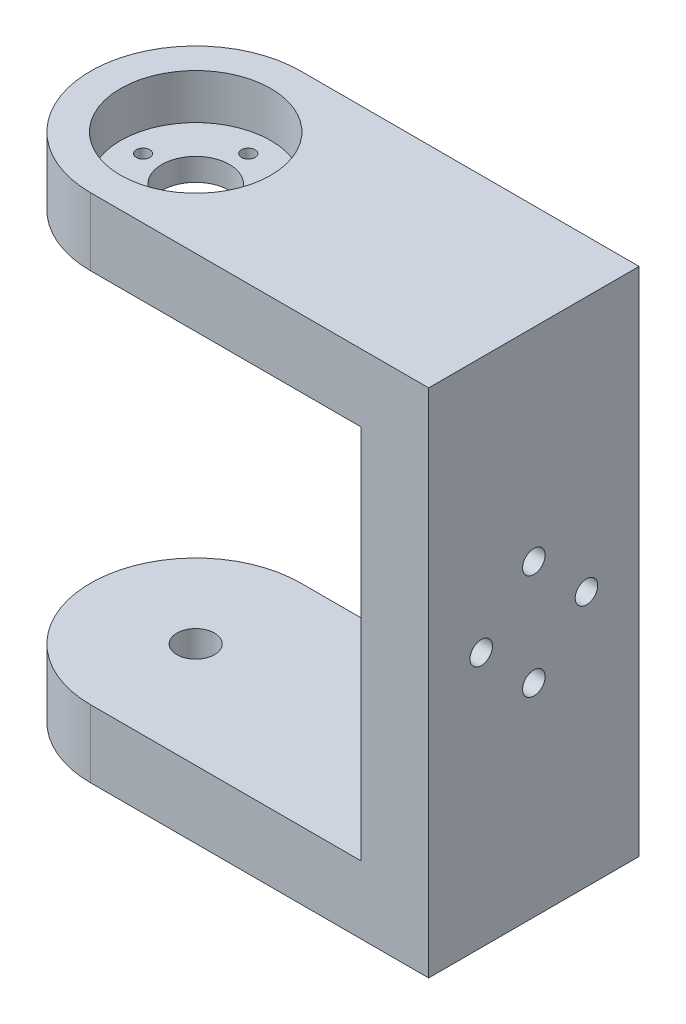
ISO-10303-21;
HEADER;
FILE_DESCRIPTION(('STEP AP214'),'2;1');
FILE_NAME('part.step','',(''),(''),'','','');
FILE_SCHEMA(('AUTOMOTIVE_DESIGN { 1 0 10303 214 1 1 1 1 }'));
ENDSEC;
DATA;
#1=APPLICATION_CONTEXT('core data for automotive mechanical design processes');
#2=APPLICATION_PROTOCOL_DEFINITION('international standard','automotive_design',2000,#1);
#3=PRODUCT_CONTEXT('',#1,'mechanical');
#4=PRODUCT('Part','Part','',(#3));
#5=PRODUCT_RELATED_PRODUCT_CATEGORY('part','',(#4));
#6=PRODUCT_DEFINITION_FORMATION('','',#4);
#7=PRODUCT_DEFINITION_CONTEXT('part definition',#1,'design');
#8=PRODUCT_DEFINITION('design','',#6,#7);
#9=PRODUCT_DEFINITION_SHAPE('','',#8);
#10=(LENGTH_UNIT() NAMED_UNIT(*) SI_UNIT(.MILLI.,.METRE.));
#11=(NAMED_UNIT(*) PLANE_ANGLE_UNIT() SI_UNIT($,.RADIAN.));
#12=(NAMED_UNIT(*) SI_UNIT($,.STERADIAN.) SOLID_ANGLE_UNIT());
#13=UNCERTAINTY_MEASURE_WITH_UNIT(LENGTH_MEASURE(1.E-05),#10,'distance_accuracy_value','');
#14=(GEOMETRIC_REPRESENTATION_CONTEXT(3) GLOBAL_UNCERTAINTY_ASSIGNED_CONTEXT((#13)) GLOBAL_UNIT_ASSIGNED_CONTEXT((#10,
#11,#12)) REPRESENTATION_CONTEXT('',''));
#15=CARTESIAN_POINT('',(0.,0.,0.));
#16=DIRECTION('',(0.,0.,1.));
#17=DIRECTION('',(1.,0.,0.));
#18=AXIS2_PLACEMENT_3D('',#15,#16,#17);
#19=CARTESIAN_POINT('',(-43.8793103448276,25.801724137931,14.));
#20=DIRECTION('',(0.,1.,0.));
#21=DIRECTION('',(-1.,0.,0.));
#22=AXIS2_PLACEMENT_3D('',#19,#20,#21);
#23=CYLINDRICAL_SURFACE('',#22,4.5);
#24=CARTESIAN_POINT('',(-43.8793103448276,26.801724137931,14.));
#25=DIRECTION('',(0.,-1.,0.));
#26=DIRECTION('',(1.,0.,0.));
#27=AXIS2_PLACEMENT_3D('',#24,#25,#26);
#28=CIRCLE('',#27,4.5);
#29=CARTESIAN_POINT('',(-39.3793103448276,26.801724137931,14.));
#30=VERTEX_POINT('',#29);
#31=EDGE_CURVE('E141',#30,#30,#28,.T.);
#32=ORIENTED_EDGE('',*,*,#31,.T.);
#33=EDGE_LOOP('',(#32));
#34=FACE_BOUND('',#33,.T.);
#35=CARTESIAN_POINT('',(-43.8793103448276,29.801724137931,14.));
#36=DIRECTION('',(0.,1.,0.));
#37=DIRECTION('',(-1.,0.,0.));
#38=AXIS2_PLACEMENT_3D('',#35,#36,#37);
#39=CIRCLE('',#38,4.5);
#40=CARTESIAN_POINT('',(-48.3793103448276,29.801724137931,14.));
#41=VERTEX_POINT('',#40);
#42=EDGE_CURVE('E69',#41,#41,#39,.F.);
#43=ORIENTED_EDGE('',*,*,#42,.F.);
#44=EDGE_LOOP('',(#43));
#45=FACE_BOUND('',#44,.T.);
#46=ADVANCED_FACE('F65',(#34,#45),#23,.F.);
#47=CARTESIAN_POINT('',(0.,35.801724137931,28.));
#48=DIRECTION('',(0.,-1.,0.));
#49=DIRECTION('',(1.,0.,0.));
#50=AXIS2_PLACEMENT_3D('',#47,#48,#49);
#51=PLANE('',#50);
#52=CARTESIAN_POINT('',(-43.8793103448276,35.801724137931,14.));
#53=DIRECTION('',(0.,1.,0.));
#54=DIRECTION('',(-1.,0.,0.));
#55=AXIS2_PLACEMENT_3D('',#52,#53,#54);
#56=CIRCLE('',#55,10.);
#57=CARTESIAN_POINT('',(-53.8793103448276,35.801724137931,14.));
#58=VERTEX_POINT('',#57);
#59=EDGE_CURVE('E211',#58,#58,#56,.T.);
#60=ORIENTED_EDGE('',*,*,#59,.F.);
#61=EDGE_LOOP('',(#60));
#62=FACE_BOUND('',#61,.T.);
#63=DIRECTION('',(-1.,0.,0.));
#64=VECTOR('',#63,1.);
#65=CARTESIAN_POINT('',(0.,35.801724137931,0.));
#66=LINE('',#65,#64);
#67=CARTESIAN_POINT('',(1.1206896551724,35.801724137931,0.));
#68=VERTEX_POINT('',#67);
#69=CARTESIAN_POINT('',(-43.8793103448276,35.801724137931,0.));
#70=VERTEX_POINT('',#69);
#71=EDGE_CURVE('E148',#68,#70,#66,.T.);
#72=ORIENTED_EDGE('',*,*,#71,.T.);
#73=CARTESIAN_POINT('',(-43.8793103448276,35.801724137931,14.));
#74=DIRECTION('',(0.,1.,0.));
#75=DIRECTION('',(-1.,0.,0.));
#76=AXIS2_PLACEMENT_3D('',#73,#74,#75);
#77=CIRCLE('',#76,14.);
#78=CARTESIAN_POINT('',(-43.8793103448276,35.801724137931,28.));
#79=VERTEX_POINT('',#78);
#80=EDGE_CURVE('E131',#70,#79,#77,.T.);
#81=ORIENTED_EDGE('',*,*,#80,.T.);
#82=DIRECTION('',(-1.,0.,0.));
#83=VECTOR('',#82,1.);
#84=CARTESIAN_POINT('',(0.,35.801724137931,28.));
#85=LINE('',#84,#83);
#86=CARTESIAN_POINT('',(1.1206896551724,35.801724137931,28.));
#87=VERTEX_POINT('',#86);
#88=EDGE_CURVE('E182',#87,#79,#85,.T.);
#89=ORIENTED_EDGE('',*,*,#88,.F.);
#90=DIRECTION('',(0.,0.,-1.));
#91=VECTOR('',#90,1.);
#92=CARTESIAN_POINT('',(1.1206896551724,35.801724137931,28.));
#93=LINE('',#92,#91);
#94=EDGE_CURVE('E155',#87,#68,#93,.T.);
#95=ORIENTED_EDGE('',*,*,#94,.T.);
#96=EDGE_LOOP('',(#72,#81,#89,#95));
#97=FACE_BOUND('',#96,.T.);
#98=ADVANCED_FACE('F67',(#62,#97),#51,.F.);
#99=CARTESIAN_POINT('',(0.,26.801724137931,28.));
#100=DIRECTION('',(0.,-1.,0.));
#101=DIRECTION('',(1.,0.,0.));
#102=AXIS2_PLACEMENT_3D('',#99,#100,#101);
#103=PLANE('',#102);
#104=CARTESIAN_POINT('',(-43.8793103448276,26.801724137931,21.0030113948443));
#105=DIRECTION('',(0.,-1.,0.));
#106=DIRECTION('',(1.,0.,0.));
#107=AXIS2_PLACEMENT_3D('',#104,#105,#106);
#108=CIRCLE('',#107,0.899999999999996);
#109=CARTESIAN_POINT('',(-42.9793103448276,26.801724137931,21.0030113948443));
#110=VERTEX_POINT('',#109);
#111=EDGE_CURVE('E323',#110,#110,#108,.T.);
#112=ORIENTED_EDGE('',*,*,#111,.F.);
#113=EDGE_LOOP('',(#112));
#114=FACE_BOUND('',#113,.T.);
#115=CARTESIAN_POINT('',(-36.8793103448276,26.801724137931,14.));
#116=DIRECTION('',(0.,-1.,0.));
#117=DIRECTION('',(1.,0.,0.));
#118=AXIS2_PLACEMENT_3D('',#115,#116,#117);
#119=CIRCLE('',#118,0.899999999999997);
#120=CARTESIAN_POINT('',(-35.9793103448276,26.801724137931,14.));
#121=VERTEX_POINT('',#120);
#122=EDGE_CURVE('E329',#121,#121,#119,.T.);
#123=ORIENTED_EDGE('',*,*,#122,.F.);
#124=EDGE_LOOP('',(#123));
#125=FACE_BOUND('',#124,.T.);
#126=CARTESIAN_POINT('',(-43.8793103448276,26.801724137931,7.));
#127=DIRECTION('',(0.,-1.,0.));
#128=DIRECTION('',(1.,0.,0.));
#129=AXIS2_PLACEMENT_3D('',#126,#127,#128);
#130=CIRCLE('',#129,0.899999999999997);
#131=CARTESIAN_POINT('',(-42.9793103448276,26.801724137931,7.));
#132=VERTEX_POINT('',#131);
#133=EDGE_CURVE('E406',#132,#132,#130,.T.);
#134=ORIENTED_EDGE('',*,*,#133,.F.);
#135=EDGE_LOOP('',(#134));
#136=FACE_BOUND('',#135,.T.);
#137=CARTESIAN_POINT('',(-50.8793103448276,26.801724137931,14.));
#138=DIRECTION('',(0.,-1.,0.));
#139=DIRECTION('',(1.,0.,0.));
#140=AXIS2_PLACEMENT_3D('',#137,#138,#139);
#141=CIRCLE('',#140,0.899999999999997);
#142=CARTESIAN_POINT('',(-49.9793103448276,26.801724137931,14.));
#143=VERTEX_POINT('',#142);
#144=EDGE_CURVE('E402',#143,#143,#141,.T.);
#145=ORIENTED_EDGE('',*,*,#144,.F.);
#146=EDGE_LOOP('',(#145));
#147=FACE_BOUND('',#146,.T.);
#148=ORIENTED_EDGE('',*,*,#31,.F.);
#149=EDGE_LOOP('',(#148));
#150=FACE_BOUND('',#149,.T.);
#151=CARTESIAN_POINT('',(-43.8793103448276,26.801724137931,14.));
#152=DIRECTION('',(0.,-1.,0.));
#153=DIRECTION('',(1.,0.,0.));
#154=AXIS2_PLACEMENT_3D('',#151,#152,#153);
#155=CIRCLE('',#154,14.);
#156=CARTESIAN_POINT('',(-43.8793103448276,26.801724137931,28.));
#157=VERTEX_POINT('',#156);
#158=CARTESIAN_POINT('',(-43.8793103448276,26.801724137931,0.));
#159=VERTEX_POINT('',#158);
#160=EDGE_CURVE('E91',#157,#159,#155,.T.);
#161=ORIENTED_EDGE('',*,*,#160,.T.);
#162=DIRECTION('',(-1.,0.,0.));
#163=VECTOR('',#162,1.);
#164=CARTESIAN_POINT('',(0.,26.801724137931,0.));
#165=LINE('',#164,#163);
#166=CARTESIAN_POINT('',(-7.8793103448276,26.801724137931,0.));
#167=VERTEX_POINT('',#166);
#168=EDGE_CURVE('E152',#167,#159,#165,.T.);
#169=ORIENTED_EDGE('',*,*,#168,.F.);
#170=DIRECTION('',(0.,0.,-1.));
#171=VECTOR('',#170,1.);
#172=CARTESIAN_POINT('',(-7.8793103448276,26.801724137931,28.));
#173=LINE('',#172,#171);
#174=CARTESIAN_POINT('',(-7.8793103448276,26.801724137931,28.));
#175=VERTEX_POINT('',#174);
#176=EDGE_CURVE('E193',#175,#167,#173,.T.);
#177=ORIENTED_EDGE('',*,*,#176,.F.);
#178=DIRECTION('',(-1.,0.,0.));
#179=VECTOR('',#178,1.);
#180=CARTESIAN_POINT('',(0.,26.801724137931,28.));
#181=LINE('',#180,#179);
#182=EDGE_CURVE('E231',#175,#157,#181,.T.);
#183=ORIENTED_EDGE('',*,*,#182,.T.);
#184=EDGE_LOOP('',(#161,#169,#177,#183));
#185=FACE_BOUND('',#184,.T.);
#186=ADVANCED_FACE('F254',(#114,#125,#136,#147,#150,#185),#103,.T.);
#187=CARTESIAN_POINT('',(0.,-23.198275862069,28.));
#188=DIRECTION('',(0.,-1.,0.));
#189=DIRECTION('',(1.,0.,0.));
#190=AXIS2_PLACEMENT_3D('',#187,#188,#189);
#191=PLANE('',#190);
#192=CARTESIAN_POINT('',(-43.8793103448276,-23.198275862069,14.));
#193=DIRECTION('',(0.,-1.,0.));
#194=DIRECTION('',(1.,0.,0.));
#195=AXIS2_PLACEMENT_3D('',#192,#193,#194);
#196=CIRCLE('',#195,2.5);
#197=CARTESIAN_POINT('',(-41.3793103448276,-23.198275862069,14.));
#198=VERTEX_POINT('',#197);
#199=EDGE_CURVE('E157',#198,#198,#196,.T.);
#200=ORIENTED_EDGE('',*,*,#199,.T.);
#201=EDGE_LOOP('',(#200));
#202=FACE_BOUND('',#201,.T.);
#203=DIRECTION('',(-1.,0.,0.));
#204=VECTOR('',#203,1.);
#205=CARTESIAN_POINT('',(0.,-23.198275862069,0.));
#206=LINE('',#205,#204);
#207=CARTESIAN_POINT('',(-7.8793103448276,-23.198275862069,0.));
#208=VERTEX_POINT('',#207);
#209=CARTESIAN_POINT('',(-43.8793103448276,-23.198275862069,0.));
#210=VERTEX_POINT('',#209);
#211=EDGE_CURVE('E172',#208,#210,#206,.T.);
#212=ORIENTED_EDGE('',*,*,#211,.T.);
#213=CARTESIAN_POINT('',(-43.8793103448276,-23.198275862069,14.));
#214=DIRECTION('',(0.,-1.,0.));
#215=DIRECTION('',(1.,0.,0.));
#216=AXIS2_PLACEMENT_3D('',#213,#214,#215);
#217=CIRCLE('',#216,14.);
#218=CARTESIAN_POINT('',(-43.8793103448276,-23.198275862069,28.));
#219=VERTEX_POINT('',#218);
#220=EDGE_CURVE('E224',#219,#210,#217,.T.);
#221=ORIENTED_EDGE('',*,*,#220,.F.);
#222=DIRECTION('',(-1.,0.,0.));
#223=VECTOR('',#222,1.);
#224=CARTESIAN_POINT('',(0.,-23.198275862069,28.));
#225=LINE('',#224,#223);
#226=CARTESIAN_POINT('',(-7.8793103448276,-23.198275862069,28.));
#227=VERTEX_POINT('',#226);
#228=EDGE_CURVE('E238',#227,#219,#225,.T.);
#229=ORIENTED_EDGE('',*,*,#228,.F.);
#230=DIRECTION('',(0.,0.,-1.));
#231=VECTOR('',#230,1.);
#232=CARTESIAN_POINT('',(-7.8793103448276,-23.198275862069,28.));
#233=LINE('',#232,#231);
#234=EDGE_CURVE('E189',#227,#208,#233,.T.);
#235=ORIENTED_EDGE('',*,*,#234,.T.);
#236=EDGE_LOOP('',(#212,#221,#229,#235));
#237=FACE_BOUND('',#236,.T.);
#238=ADVANCED_FACE('F262',(#202,#237),#191,.F.);
#239=CARTESIAN_POINT('',(0.,-32.198275862069,28.));
#240=DIRECTION('',(0.,1.,0.));
#241=DIRECTION('',(-1.,0.,0.));
#242=AXIS2_PLACEMENT_3D('',#239,#240,#241);
#243=PLANE('',#242);
#244=CARTESIAN_POINT('',(-43.8793103448276,-32.198275862069,14.));
#245=DIRECTION('',(0.,1.,0.));
#246=DIRECTION('',(-1.,0.,0.));
#247=AXIS2_PLACEMENT_3D('',#244,#245,#246);
#248=CIRCLE('',#247,2.5);
#249=CARTESIAN_POINT('',(-46.3793103448276,-32.198275862069,14.));
#250=VERTEX_POINT('',#249);
#251=EDGE_CURVE('E164',#250,#250,#248,.T.);
#252=ORIENTED_EDGE('',*,*,#251,.T.);
#253=EDGE_LOOP('',(#252));
#254=FACE_BOUND('',#253,.T.);
#255=CARTESIAN_POINT('',(-43.8793103448276,-32.198275862069,14.));
#256=DIRECTION('',(0.,1.,0.));
#257=DIRECTION('',(-1.,0.,0.));
#258=AXIS2_PLACEMENT_3D('',#255,#256,#257);
#259=CIRCLE('',#258,14.);
#260=CARTESIAN_POINT('',(-43.8793103448276,-32.198275862069,0.));
#261=VERTEX_POINT('',#260);
#262=CARTESIAN_POINT('',(-43.8793103448276,-32.198275862069,28.));
#263=VERTEX_POINT('',#262);
#264=EDGE_CURVE('E83',#261,#263,#259,.T.);
#265=ORIENTED_EDGE('',*,*,#264,.F.);
#266=DIRECTION('',(1.,0.,0.));
#267=VECTOR('',#266,1.);
#268=CARTESIAN_POINT('',(0.,-32.198275862069,0.));
#269=LINE('',#268,#267);
#270=CARTESIAN_POINT('',(1.1206896551724,-32.198275862069,0.));
#271=VERTEX_POINT('',#270);
#272=EDGE_CURVE('E176',#261,#271,#269,.T.);
#273=ORIENTED_EDGE('',*,*,#272,.T.);
#274=DIRECTION('',(0.,0.,-1.));
#275=VECTOR('',#274,1.);
#276=CARTESIAN_POINT('',(1.1206896551724,-32.198275862069,28.));
#277=LINE('',#276,#275);
#278=CARTESIAN_POINT('',(1.1206896551724,-32.198275862069,28.));
#279=VERTEX_POINT('',#278);
#280=EDGE_CURVE('E185',#279,#271,#277,.T.);
#281=ORIENTED_EDGE('',*,*,#280,.F.);
#282=DIRECTION('',(1.,0.,0.));
#283=VECTOR('',#282,1.);
#284=CARTESIAN_POINT('',(0.,-32.198275862069,28.));
#285=LINE('',#284,#283);
#286=EDGE_CURVE('E241',#263,#279,#285,.T.);
#287=ORIENTED_EDGE('',*,*,#286,.F.);
#288=EDGE_LOOP('',(#265,#273,#281,#287));
#289=FACE_BOUND('',#288,.T.);
#290=ADVANCED_FACE('F266',(#254,#289),#243,.F.);
#291=CARTESIAN_POINT('',(-7.8793103448276,0.,28.));
#292=DIRECTION('',(1.,0.,0.));
#293=DIRECTION('',(0.,0.,-1.));
#294=AXIS2_PLACEMENT_3D('',#291,#292,#293);
#295=PLANE('',#294);
#296=CARTESIAN_POINT('',(-7.8793103448276,8.80172413793104,14.));
#297=DIRECTION('',(1.,0.,0.));
#298=DIRECTION('',(0.,0.,-1.));
#299=AXIS2_PLACEMENT_3D('',#296,#297,#298);
#300=CIRCLE('',#299,1.5);
#301=CARTESIAN_POINT('',(-7.8793103448276,8.80172413793104,12.5));
#302=VERTEX_POINT('',#301);
#303=EDGE_CURVE('E217',#302,#302,#300,.T.);
#304=ORIENTED_EDGE('',*,*,#303,.T.);
#305=EDGE_LOOP('',(#304));
#306=FACE_BOUND('',#305,.T.);
#307=CARTESIAN_POINT('',(-7.8793103448276,-5.19827586206896,14.));
#308=DIRECTION('',(1.,0.,0.));
#309=DIRECTION('',(0.,0.,-1.));
#310=AXIS2_PLACEMENT_3D('',#307,#308,#309);
#311=CIRCLE('',#310,1.5);
#312=CARTESIAN_POINT('',(-7.8793103448276,-5.19827586206896,12.5));
#313=VERTEX_POINT('',#312);
#314=EDGE_CURVE('E340',#313,#313,#311,.T.);
#315=ORIENTED_EDGE('',*,*,#314,.T.);
#316=EDGE_LOOP('',(#315));
#317=FACE_BOUND('',#316,.T.);
#318=CARTESIAN_POINT('',(-7.8793103448276,1.80172413793104,7.00000000000001));
#319=DIRECTION('',(1.,0.,0.));
#320=DIRECTION('',(0.,0.,-1.));
#321=AXIS2_PLACEMENT_3D('',#318,#319,#320);
#322=CIRCLE('',#321,1.5);
#323=CARTESIAN_POINT('',(-7.8793103448276,1.80172413793104,5.50000000000001));
#324=VERTEX_POINT('',#323);
#325=EDGE_CURVE('E337',#324,#324,#322,.T.);
#326=ORIENTED_EDGE('',*,*,#325,.T.);
#327=EDGE_LOOP('',(#326));
#328=FACE_BOUND('',#327,.T.);
#329=CARTESIAN_POINT('',(-7.8793103448276,1.80172413793104,21.));
#330=DIRECTION('',(1.,0.,0.));
#331=DIRECTION('',(0.,0.,-1.));
#332=AXIS2_PLACEMENT_3D('',#329,#330,#331);
#333=CIRCLE('',#332,1.5);
#334=CARTESIAN_POINT('',(-7.8793103448276,1.80172413793104,19.5));
#335=VERTEX_POINT('',#334);
#336=EDGE_CURVE('E333',#335,#335,#333,.T.);
#337=ORIENTED_EDGE('',*,*,#336,.T.);
#338=EDGE_LOOP('',(#337));
#339=FACE_BOUND('',#338,.T.);
#340=DIRECTION('',(0.,-1.,0.));
#341=VECTOR('',#340,1.);
#342=CARTESIAN_POINT('',(-7.8793103448276,0.,0.));
#343=LINE('',#342,#341);
#344=EDGE_CURVE('E161',#167,#208,#343,.T.);
#345=ORIENTED_EDGE('',*,*,#344,.T.);
#346=ORIENTED_EDGE('',*,*,#234,.F.);
#347=DIRECTION('',(0.,-1.,0.));
#348=VECTOR('',#347,1.);
#349=CARTESIAN_POINT('',(-7.8793103448276,0.,28.));
#350=LINE('',#349,#348);
#351=EDGE_CURVE('E235',#175,#227,#350,.T.);
#352=ORIENTED_EDGE('',*,*,#351,.F.);
#353=ORIENTED_EDGE('',*,*,#176,.T.);
#354=EDGE_LOOP('',(#345,#346,#352,#353));
#355=FACE_BOUND('',#354,.T.);
#356=ADVANCED_FACE('F258',(#306,#317,#328,#339,#355),#295,.F.);
#357=CARTESIAN_POINT('',(1.1206896551724,0.,28.));
#358=DIRECTION('',(1.,0.,0.));
#359=DIRECTION('',(0.,1.,0.));
#360=AXIS2_PLACEMENT_3D('',#357,#358,#359);
#361=PLANE('',#360);
#362=CARTESIAN_POINT('',(1.1206896551724,8.80172413793104,14.));
#363=DIRECTION('',(1.,0.,0.));
#364=DIRECTION('',(0.,1.,0.));
#365=AXIS2_PLACEMENT_3D('',#362,#363,#364);
#366=CIRCLE('',#365,1.5);
#367=CARTESIAN_POINT('',(1.1206896551724,10.301724137931,14.));
#368=VERTEX_POINT('',#367);
#369=EDGE_CURVE('E309',#368,#368,#366,.T.);
#370=ORIENTED_EDGE('',*,*,#369,.F.);
#371=EDGE_LOOP('',(#370));
#372=FACE_BOUND('',#371,.T.);
#373=CARTESIAN_POINT('',(1.1206896551724,-5.19827586206896,14.));
#374=DIRECTION('',(1.,0.,0.));
#375=DIRECTION('',(0.,1.,0.));
#376=AXIS2_PLACEMENT_3D('',#373,#374,#375);
#377=CIRCLE('',#376,1.5);
#378=CARTESIAN_POINT('',(1.1206896551724,-3.69827586206896,14.));
#379=VERTEX_POINT('',#378);
#380=EDGE_CURVE('E313',#379,#379,#377,.T.);
#381=ORIENTED_EDGE('',*,*,#380,.F.);
#382=EDGE_LOOP('',(#381));
#383=FACE_BOUND('',#382,.T.);
#384=CARTESIAN_POINT('',(1.1206896551724,1.80172413793104,7.00000000000001));
#385=DIRECTION('',(1.,0.,0.));
#386=DIRECTION('',(0.,1.,0.));
#387=AXIS2_PLACEMENT_3D('',#384,#385,#386);
#388=CIRCLE('',#387,1.5);
#389=CARTESIAN_POINT('',(1.1206896551724,3.30172413793104,7.00000000000001));
#390=VERTEX_POINT('',#389);
#391=EDGE_CURVE('E317',#390,#390,#388,.T.);
#392=ORIENTED_EDGE('',*,*,#391,.F.);
#393=EDGE_LOOP('',(#392));
#394=FACE_BOUND('',#393,.T.);
#395=CARTESIAN_POINT('',(1.1206896551724,1.80172413793104,21.));
#396=DIRECTION('',(1.,0.,0.));
#397=DIRECTION('',(0.,1.,0.));
#398=AXIS2_PLACEMENT_3D('',#395,#396,#397);
#399=CIRCLE('',#398,1.5);
#400=CARTESIAN_POINT('',(1.1206896551724,3.30172413793104,21.));
#401=VERTEX_POINT('',#400);
#402=EDGE_CURVE('E320',#401,#401,#399,.T.);
#403=ORIENTED_EDGE('',*,*,#402,.F.);
#404=EDGE_LOOP('',(#403));
#405=FACE_BOUND('',#404,.T.);
#406=DIRECTION('',(0.,-1.,0.));
#407=VECTOR('',#406,1.);
#408=CARTESIAN_POINT('',(1.1206896551724,0.,0.));
#409=LINE('',#408,#407);
#410=EDGE_CURVE('E179',#68,#271,#409,.T.);
#411=ORIENTED_EDGE('',*,*,#410,.F.);
#412=ORIENTED_EDGE('',*,*,#94,.F.);
#413=DIRECTION('',(0.,-1.,0.));
#414=VECTOR('',#413,1.);
#415=CARTESIAN_POINT('',(1.1206896551724,0.,28.));
#416=LINE('',#415,#414);
#417=EDGE_CURVE('E167',#87,#279,#416,.T.);
#418=ORIENTED_EDGE('',*,*,#417,.T.);
#419=ORIENTED_EDGE('',*,*,#280,.T.);
#420=EDGE_LOOP('',(#411,#412,#418,#419));
#421=FACE_BOUND('',#420,.T.);
#422=ADVANCED_FACE('F250',(#372,#383,#394,#405,#421),#361,.T.);
#423=CARTESIAN_POINT('',(0.,0.,28.));
#424=DIRECTION('',(0.,0.,1.));
#425=DIRECTION('',(1.,0.,0.));
#426=AXIS2_PLACEMENT_3D('',#423,#424,#425);
#427=PLANE('',#426);
#428=DIRECTION('',(0.,1.,0.));
#429=VECTOR('',#428,1.);
#430=CARTESIAN_POINT('',(-43.8793103448276,-64.198275862069,28.));
#431=LINE('',#430,#429);
#432=EDGE_CURVE('E154',#263,#219,#431,.T.);
#433=ORIENTED_EDGE('',*,*,#432,.F.);
#434=ORIENTED_EDGE('',*,*,#286,.T.);
#435=ORIENTED_EDGE('',*,*,#417,.F.);
#436=ORIENTED_EDGE('',*,*,#88,.T.);
#437=EDGE_CURVE('E135',#157,#79,#431,.T.);
#438=ORIENTED_EDGE('',*,*,#437,.F.);
#439=ORIENTED_EDGE('',*,*,#182,.F.);
#440=ORIENTED_EDGE('',*,*,#351,.T.);
#441=ORIENTED_EDGE('',*,*,#228,.T.);
#442=EDGE_LOOP('',(#433,#434,#435,#436,#438,#439,#440,#441));
#443=FACE_BOUND('',#442,.T.);
#444=ADVANCED_FACE('F251',(#443),#427,.T.);
#445=CARTESIAN_POINT('',(0.,0.,0.));
#446=DIRECTION('',(0.,0.,1.));
#447=DIRECTION('',(1.,0.,0.));
#448=AXIS2_PLACEMENT_3D('',#445,#446,#447);
#449=PLANE('',#448);
#450=ORIENTED_EDGE('',*,*,#272,.F.);
#451=DIRECTION('',(0.,1.,0.));
#452=VECTOR('',#451,1.);
#453=CARTESIAN_POINT('',(-43.8793103448276,-64.198275862069,0.));
#454=LINE('',#453,#452);
#455=EDGE_CURVE('E12',#261,#210,#454,.T.);
#456=ORIENTED_EDGE('',*,*,#455,.T.);
#457=ORIENTED_EDGE('',*,*,#211,.F.);
#458=ORIENTED_EDGE('',*,*,#344,.F.);
#459=ORIENTED_EDGE('',*,*,#168,.T.);
#460=EDGE_CURVE('E75',#159,#70,#454,.T.);
#461=ORIENTED_EDGE('',*,*,#460,.T.);
#462=ORIENTED_EDGE('',*,*,#71,.F.);
#463=ORIENTED_EDGE('',*,*,#410,.T.);
#464=EDGE_LOOP('',(#450,#456,#457,#458,#459,#461,#462,#463));
#465=FACE_BOUND('',#464,.T.);
#466=ADVANCED_FACE('F146',(#465),#449,.F.);
#467=CARTESIAN_POINT('',(-43.8793103448276,-64.198275862069,14.));
#468=DIRECTION('',(0.,1.,0.));
#469=DIRECTION('',(-1.,0.,0.));
#470=AXIS2_PLACEMENT_3D('',#467,#468,#469);
#471=CYLINDRICAL_SURFACE('',#470,14.);
#472=ORIENTED_EDGE('',*,*,#437,.T.);
#473=ORIENTED_EDGE('',*,*,#80,.F.);
#474=ORIENTED_EDGE('',*,*,#460,.F.);
#475=ORIENTED_EDGE('',*,*,#160,.F.);
#476=EDGE_LOOP('',(#472,#473,#474,#475));
#477=FACE_BOUND('',#476,.T.);
#478=ADVANCED_FACE('F133',(#477),#471,.T.);
#479=ORIENTED_EDGE('',*,*,#220,.T.);
#480=ORIENTED_EDGE('',*,*,#455,.F.);
#481=ORIENTED_EDGE('',*,*,#264,.T.);
#482=ORIENTED_EDGE('',*,*,#432,.T.);
#483=EDGE_LOOP('',(#479,#480,#481,#482));
#484=FACE_BOUND('',#483,.T.);
#485=ADVANCED_FACE('F264',(#484),#471,.T.);
#486=CARTESIAN_POINT('',(-43.8793103448276,-64.198275862069,14.));
#487=DIRECTION('',(0.,1.,0.));
#488=DIRECTION('',(-1.,0.,0.));
#489=AXIS2_PLACEMENT_3D('',#486,#487,#488);
#490=CYLINDRICAL_SURFACE('',#489,2.5);
#491=ORIENTED_EDGE('',*,*,#251,.F.);
#492=EDGE_LOOP('',(#491));
#493=FACE_BOUND('',#492,.T.);
#494=ORIENTED_EDGE('',*,*,#199,.F.);
#495=EDGE_LOOP('',(#494));
#496=FACE_BOUND('',#495,.T.);
#497=ADVANCED_FACE('F293',(#493,#496),#490,.F.);
#498=CARTESIAN_POINT('',(-43.8793103448276,29.801724137931,14.));
#499=DIRECTION('',(0.,1.,0.));
#500=DIRECTION('',(-1.,0.,0.));
#501=AXIS2_PLACEMENT_3D('',#498,#499,#500);
#502=PLANE('',#501);
#503=CARTESIAN_POINT('',(-43.8793103448276,29.801724137931,21.0030113948443));
#504=DIRECTION('',(0.,1.,0.));
#505=DIRECTION('',(-1.,0.,0.));
#506=AXIS2_PLACEMENT_3D('',#503,#504,#505);
#507=CIRCLE('',#506,0.899999999999996);
#508=CARTESIAN_POINT('',(-44.7793103448276,29.801724137931,21.0030113948443));
#509=VERTEX_POINT('',#508);
#510=EDGE_CURVE('E383',#509,#509,#507,.T.);
#511=ORIENTED_EDGE('',*,*,#510,.F.);
#512=EDGE_LOOP('',(#511));
#513=FACE_BOUND('',#512,.T.);
#514=CARTESIAN_POINT('',(-36.8793103448276,29.801724137931,14.));
#515=DIRECTION('',(0.,1.,0.));
#516=DIRECTION('',(-1.,0.,0.));
#517=AXIS2_PLACEMENT_3D('',#514,#515,#516);
#518=CIRCLE('',#517,0.899999999999997);
#519=CARTESIAN_POINT('',(-37.7793103448276,29.801724137931,14.));
#520=VERTEX_POINT('',#519);
#521=EDGE_CURVE('E387',#520,#520,#518,.T.);
#522=ORIENTED_EDGE('',*,*,#521,.F.);
#523=EDGE_LOOP('',(#522));
#524=FACE_BOUND('',#523,.T.);
#525=CARTESIAN_POINT('',(-43.8793103448276,29.801724137931,7.));
#526=DIRECTION('',(0.,1.,0.));
#527=DIRECTION('',(-1.,0.,0.));
#528=AXIS2_PLACEMENT_3D('',#525,#526,#527);
#529=CIRCLE('',#528,0.899999999999997);
#530=CARTESIAN_POINT('',(-44.7793103448276,29.801724137931,7.));
#531=VERTEX_POINT('',#530);
#532=EDGE_CURVE('E391',#531,#531,#529,.T.);
#533=ORIENTED_EDGE('',*,*,#532,.F.);
#534=EDGE_LOOP('',(#533));
#535=FACE_BOUND('',#534,.T.);
#536=CARTESIAN_POINT('',(-50.8793103448276,29.801724137931,14.));
#537=DIRECTION('',(0.,1.,0.));
#538=DIRECTION('',(-1.,0.,0.));
#539=AXIS2_PLACEMENT_3D('',#536,#537,#538);
#540=CIRCLE('',#539,0.899999999999997);
#541=CARTESIAN_POINT('',(-51.7793103448276,29.801724137931,14.));
#542=VERTEX_POINT('',#541);
#543=EDGE_CURVE('E394',#542,#542,#540,.T.);
#544=ORIENTED_EDGE('',*,*,#543,.F.);
#545=EDGE_LOOP('',(#544));
#546=FACE_BOUND('',#545,.T.);
#547=CARTESIAN_POINT('',(-43.8793103448276,29.801724137931,14.));
#548=DIRECTION('',(0.,1.,0.));
#549=DIRECTION('',(-1.,0.,0.));
#550=AXIS2_PLACEMENT_3D('',#547,#548,#549);
#551=CIRCLE('',#550,10.);
#552=CARTESIAN_POINT('',(-53.8793103448276,29.801724137931,14.));
#553=VERTEX_POINT('',#552);
#554=EDGE_CURVE('E206',#553,#553,#551,.T.);
#555=ORIENTED_EDGE('',*,*,#554,.T.);
#556=EDGE_LOOP('',(#555));
#557=FACE_BOUND('',#556,.T.);
#558=ORIENTED_EDGE('',*,*,#42,.T.);
#559=EDGE_LOOP('',(#558));
#560=FACE_BOUND('',#559,.T.);
#561=ADVANCED_FACE('F296',(#513,#524,#535,#546,#557,#560),#502,.T.);
#562=CARTESIAN_POINT('',(-43.8793103448276,29.801724137931,14.));
#563=DIRECTION('',(0.,1.,0.));
#564=DIRECTION('',(-1.,0.,0.));
#565=AXIS2_PLACEMENT_3D('',#562,#563,#564);
#566=CYLINDRICAL_SURFACE('',#565,10.);
#567=ORIENTED_EDGE('',*,*,#554,.F.);
#568=EDGE_LOOP('',(#567));
#569=FACE_BOUND('',#568,.T.);
#570=ORIENTED_EDGE('',*,*,#59,.T.);
#571=EDGE_LOOP('',(#570));
#572=FACE_BOUND('',#571,.T.);
#573=ADVANCED_FACE('F289',(#569,#572),#566,.F.);
#574=CARTESIAN_POINT('',(-8.8793103448276,1.80172413793104,21.));
#575=DIRECTION('',(1.,0.,0.));
#576=DIRECTION('',(0.,1.,0.));
#577=AXIS2_PLACEMENT_3D('',#574,#575,#576);
#578=CYLINDRICAL_SURFACE('',#577,1.5);
#579=ORIENTED_EDGE('',*,*,#402,.T.);
#580=EDGE_LOOP('',(#579));
#581=FACE_BOUND('',#580,.T.);
#582=ORIENTED_EDGE('',*,*,#336,.F.);
#583=EDGE_LOOP('',(#582));
#584=FACE_BOUND('',#583,.T.);
#585=ADVANCED_FACE('F369',(#581,#584),#578,.F.);
#586=CARTESIAN_POINT('',(-8.8793103448276,1.80172413793104,7.00000000000001));
#587=DIRECTION('',(1.,0.,0.));
#588=DIRECTION('',(0.,1.,0.));
#589=AXIS2_PLACEMENT_3D('',#586,#587,#588);
#590=CYLINDRICAL_SURFACE('',#589,1.5);
#591=ORIENTED_EDGE('',*,*,#391,.T.);
#592=EDGE_LOOP('',(#591));
#593=FACE_BOUND('',#592,.T.);
#594=ORIENTED_EDGE('',*,*,#325,.F.);
#595=EDGE_LOOP('',(#594));
#596=FACE_BOUND('',#595,.T.);
#597=ADVANCED_FACE('F362',(#593,#596),#590,.F.);
#598=CARTESIAN_POINT('',(-8.8793103448276,-5.19827586206896,14.));
#599=DIRECTION('',(1.,0.,0.));
#600=DIRECTION('',(0.,1.,0.));
#601=AXIS2_PLACEMENT_3D('',#598,#599,#600);
#602=CYLINDRICAL_SURFACE('',#601,1.5);
#603=ORIENTED_EDGE('',*,*,#380,.T.);
#604=EDGE_LOOP('',(#603));
#605=FACE_BOUND('',#604,.T.);
#606=ORIENTED_EDGE('',*,*,#314,.F.);
#607=EDGE_LOOP('',(#606));
#608=FACE_BOUND('',#607,.T.);
#609=ADVANCED_FACE('F352',(#605,#608),#602,.F.);
#610=CARTESIAN_POINT('',(-8.8793103448276,8.80172413793104,14.));
#611=DIRECTION('',(1.,0.,0.));
#612=DIRECTION('',(0.,1.,0.));
#613=AXIS2_PLACEMENT_3D('',#610,#611,#612);
#614=CYLINDRICAL_SURFACE('',#613,1.5);
#615=ORIENTED_EDGE('',*,*,#369,.T.);
#616=EDGE_LOOP('',(#615));
#617=FACE_BOUND('',#616,.T.);
#618=ORIENTED_EDGE('',*,*,#303,.F.);
#619=EDGE_LOOP('',(#618));
#620=FACE_BOUND('',#619,.T.);
#621=ADVANCED_FACE('F349',(#617,#620),#614,.F.);
#622=CARTESIAN_POINT('',(-50.8793103448276,19.801724137931,14.));
#623=DIRECTION('',(0.,1.,0.));
#624=DIRECTION('',(-1.,0.,0.));
#625=AXIS2_PLACEMENT_3D('',#622,#623,#624);
#626=CYLINDRICAL_SURFACE('',#625,0.899999999999997);
#627=ORIENTED_EDGE('',*,*,#144,.T.);
#628=EDGE_LOOP('',(#627));
#629=FACE_BOUND('',#628,.T.);
#630=ORIENTED_EDGE('',*,*,#543,.T.);
#631=EDGE_LOOP('',(#630));
#632=FACE_BOUND('',#631,.T.);
#633=ADVANCED_FACE('F351',(#629,#632),#626,.F.);
#634=CARTESIAN_POINT('',(-43.8793103448276,19.801724137931,7.));
#635=DIRECTION('',(0.,1.,0.));
#636=DIRECTION('',(-1.,0.,0.));
#637=AXIS2_PLACEMENT_3D('',#634,#635,#636);
#638=CYLINDRICAL_SURFACE('',#637,0.899999999999997);
#639=ORIENTED_EDGE('',*,*,#133,.T.);
#640=EDGE_LOOP('',(#639));
#641=FACE_BOUND('',#640,.T.);
#642=ORIENTED_EDGE('',*,*,#532,.T.);
#643=EDGE_LOOP('',(#642));
#644=FACE_BOUND('',#643,.T.);
#645=ADVANCED_FACE('F359',(#641,#644),#638,.F.);
#646=CARTESIAN_POINT('',(-36.8793103448276,19.801724137931,14.));
#647=DIRECTION('',(0.,1.,0.));
#648=DIRECTION('',(-1.,0.,0.));
#649=AXIS2_PLACEMENT_3D('',#646,#647,#648);
#650=CYLINDRICAL_SURFACE('',#649,0.899999999999997);
#651=ORIENTED_EDGE('',*,*,#122,.T.);
#652=EDGE_LOOP('',(#651));
#653=FACE_BOUND('',#652,.T.);
#654=ORIENTED_EDGE('',*,*,#521,.T.);
#655=EDGE_LOOP('',(#654));
#656=FACE_BOUND('',#655,.T.);
#657=ADVANCED_FACE('F418',(#653,#656),#650,.F.);
#658=CARTESIAN_POINT('',(-43.8793103448276,19.801724137931,21.0030113948443));
#659=DIRECTION('',(0.,1.,0.));
#660=DIRECTION('',(-1.,0.,0.));
#661=AXIS2_PLACEMENT_3D('',#658,#659,#660);
#662=CYLINDRICAL_SURFACE('',#661,0.899999999999996);
#663=ORIENTED_EDGE('',*,*,#111,.T.);
#664=EDGE_LOOP('',(#663));
#665=FACE_BOUND('',#664,.T.);
#666=ORIENTED_EDGE('',*,*,#510,.T.);
#667=EDGE_LOOP('',(#666));
#668=FACE_BOUND('',#667,.T.);
#669=ADVANCED_FACE('F433',(#665,#668),#662,.F.);
#670=CLOSED_SHELL('',(#46,#98,#186,#238,#290,#356,#422,#444,#466,#478,#485,#497,#561,#573,#585,
#597,#609,#621,#633,#645,#657,#669));
#671=MANIFOLD_SOLID_BREP('B2',#670);
#672=ADVANCED_BREP_SHAPE_REPRESENTATION('',(#18,#671),#14);
#673=SHAPE_DEFINITION_REPRESENTATION(#9,#672);
ENDSEC;
END-ISO-10303-21;
